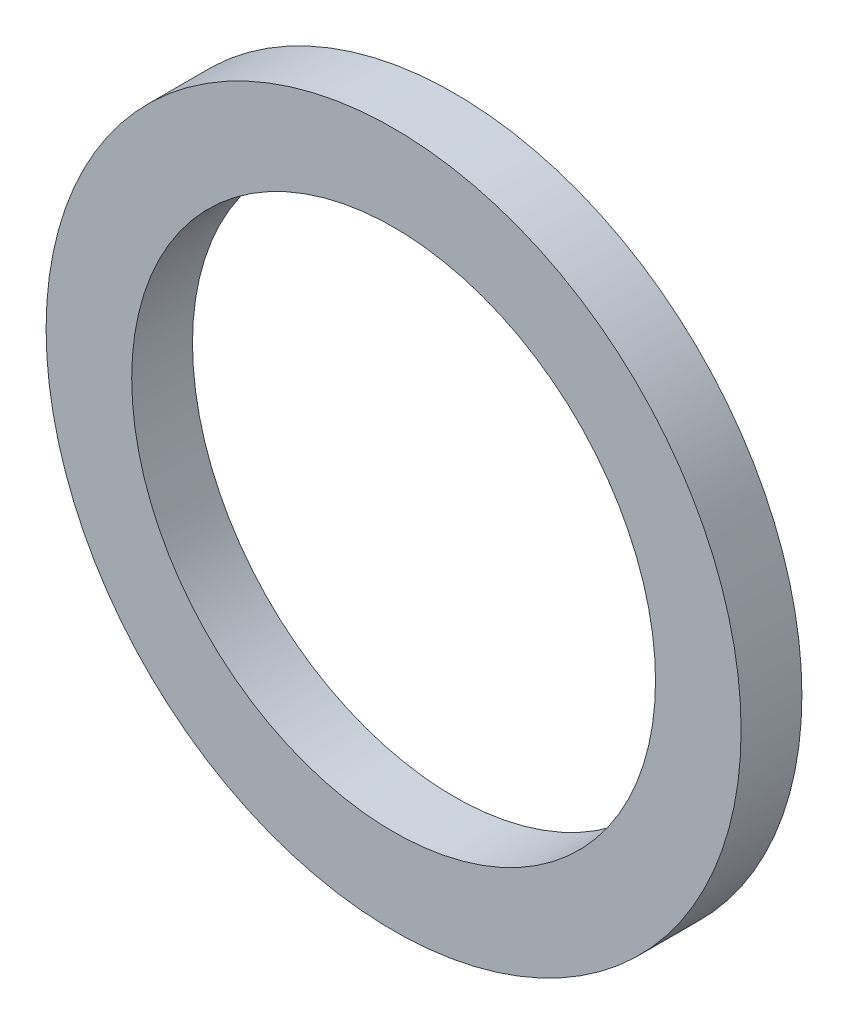
ISO-10303-21;
HEADER;
FILE_DESCRIPTION(('STEP AP214'),'2;1');
FILE_NAME('part.step','',(''),(''),'','','');
FILE_SCHEMA(('AUTOMOTIVE_DESIGN { 1 0 10303 214 1 1 1 1 }'));
ENDSEC;
DATA;
#1=APPLICATION_CONTEXT('core data for automotive mechanical design processes');
#2=APPLICATION_PROTOCOL_DEFINITION('international standard','automotive_design',2000,#1);
#3=PRODUCT_CONTEXT('',#1,'mechanical');
#4=PRODUCT('Part','Part','',(#3));
#5=PRODUCT_RELATED_PRODUCT_CATEGORY('part','',(#4));
#6=PRODUCT_DEFINITION_FORMATION('','',#4);
#7=PRODUCT_DEFINITION_CONTEXT('part definition',#1,'design');
#8=PRODUCT_DEFINITION('design','',#6,#7);
#9=PRODUCT_DEFINITION_SHAPE('','',#8);
#10=(LENGTH_UNIT() NAMED_UNIT(*) SI_UNIT(.MILLI.,.METRE.));
#11=(NAMED_UNIT(*) PLANE_ANGLE_UNIT() SI_UNIT($,.RADIAN.));
#12=(NAMED_UNIT(*) SI_UNIT($,.STERADIAN.) SOLID_ANGLE_UNIT());
#13=UNCERTAINTY_MEASURE_WITH_UNIT(LENGTH_MEASURE(1.E-05),#10,'distance_accuracy_value','');
#14=(GEOMETRIC_REPRESENTATION_CONTEXT(3) GLOBAL_UNCERTAINTY_ASSIGNED_CONTEXT((#13)) GLOBAL_UNIT_ASSIGNED_CONTEXT((#10,
#11,#12)) REPRESENTATION_CONTEXT('',''));
#15=CARTESIAN_POINT('',(0.,0.,0.));
#16=DIRECTION('',(0.,0.,1.));
#17=DIRECTION('',(1.,0.,0.));
#18=AXIS2_PLACEMENT_3D('',#15,#16,#17);
#19=CARTESIAN_POINT('',(0.,0.,2.5));
#20=DIRECTION('',(0.,0.,-1.));
#21=DIRECTION('',(-1.,0.,0.));
#22=AXIS2_PLACEMENT_3D('',#19,#20,#21);
#23=CYLINDRICAL_SURFACE('',#22,10.77);
#24=CARTESIAN_POINT('',(0.,0.,2.5));
#25=DIRECTION('',(0.,0.,1.));
#26=DIRECTION('',(1.,0.,0.));
#27=AXIS2_PLACEMENT_3D('',#24,#25,#26);
#28=CIRCLE('',#27,10.77);
#29=CARTESIAN_POINT('',(10.77,0.,2.5));
#30=VERTEX_POINT('',#29);
#31=EDGE_CURVE('E44',#30,#30,#28,.T.);
#32=ORIENTED_EDGE('',*,*,#31,.T.);
#33=EDGE_LOOP('',(#32));
#34=FACE_BOUND('',#33,.T.);
#35=CARTESIAN_POINT('',(0.,0.,0.));
#36=DIRECTION('',(0.,0.,1.));
#37=DIRECTION('',(1.,0.,0.));
#38=AXIS2_PLACEMENT_3D('',#35,#36,#37);
#39=CIRCLE('',#38,10.77);
#40=CARTESIAN_POINT('',(10.77,0.,0.));
#41=VERTEX_POINT('',#40);
#42=EDGE_CURVE('E50',#41,#41,#39,.T.);
#43=ORIENTED_EDGE('',*,*,#42,.F.);
#44=EDGE_LOOP('',(#43));
#45=FACE_BOUND('',#44,.T.);
#46=ADVANCED_FACE('F37',(#34,#45),#23,.F.);
#47=CARTESIAN_POINT('',(0.,0.,2.5));
#48=DIRECTION('',(0.,0.,-1.));
#49=DIRECTION('',(-1.,0.,0.));
#50=AXIS2_PLACEMENT_3D('',#47,#48,#49);
#51=CYLINDRICAL_SURFACE('',#50,14.29);
#52=CARTESIAN_POINT('',(0.,0.,2.5));
#53=DIRECTION('',(0.,0.,1.));
#54=DIRECTION('',(1.,0.,0.));
#55=AXIS2_PLACEMENT_3D('',#52,#53,#54);
#56=CIRCLE('',#55,14.29);
#57=CARTESIAN_POINT('',(14.29,0.,2.5));
#58=VERTEX_POINT('',#57);
#59=EDGE_CURVE('E10',#58,#58,#56,.T.);
#60=ORIENTED_EDGE('',*,*,#59,.F.);
#61=EDGE_LOOP('',(#60));
#62=FACE_BOUND('',#61,.T.);
#63=CARTESIAN_POINT('',(0.,0.,0.));
#64=DIRECTION('',(0.,0.,1.));
#65=DIRECTION('',(1.,0.,0.));
#66=AXIS2_PLACEMENT_3D('',#63,#64,#65);
#67=CIRCLE('',#66,14.29);
#68=CARTESIAN_POINT('',(14.29,0.,0.));
#69=VERTEX_POINT('',#68);
#70=EDGE_CURVE('E40',#69,#69,#67,.T.);
#71=ORIENTED_EDGE('',*,*,#70,.T.);
#72=EDGE_LOOP('',(#71));
#73=FACE_BOUND('',#72,.T.);
#74=ADVANCED_FACE('F57',(#62,#73),#51,.T.);
#75=CARTESIAN_POINT('',(0.,0.,2.5));
#76=DIRECTION('',(0.,0.,1.));
#77=DIRECTION('',(1.,0.,0.));
#78=AXIS2_PLACEMENT_3D('',#75,#76,#77);
#79=PLANE('',#78);
#80=ORIENTED_EDGE('',*,*,#31,.F.);
#81=EDGE_LOOP('',(#80));
#82=FACE_BOUND('',#81,.T.);
#83=ORIENTED_EDGE('',*,*,#59,.T.);
#84=EDGE_LOOP('',(#83));
#85=FACE_BOUND('',#84,.T.);
#86=ADVANCED_FACE('F61',(#82,#85),#79,.T.);
#87=CARTESIAN_POINT('',(0.,0.,0.));
#88=DIRECTION('',(0.,0.,1.));
#89=DIRECTION('',(1.,0.,0.));
#90=AXIS2_PLACEMENT_3D('',#87,#88,#89);
#91=PLANE('',#90);
#92=ORIENTED_EDGE('',*,*,#42,.T.);
#93=EDGE_LOOP('',(#92));
#94=FACE_BOUND('',#93,.T.);
#95=ORIENTED_EDGE('',*,*,#70,.F.);
#96=EDGE_LOOP('',(#95));
#97=FACE_BOUND('',#96,.T.);
#98=ADVANCED_FACE('F59',(#94,#97),#91,.F.);
#99=CLOSED_SHELL('',(#46,#74,#86,#98));
#100=MANIFOLD_SOLID_BREP('B2',#99);
#101=ADVANCED_BREP_SHAPE_REPRESENTATION('',(#18,#100),#14);
#102=SHAPE_DEFINITION_REPRESENTATION(#9,#101);
ENDSEC;
END-ISO-10303-21;
